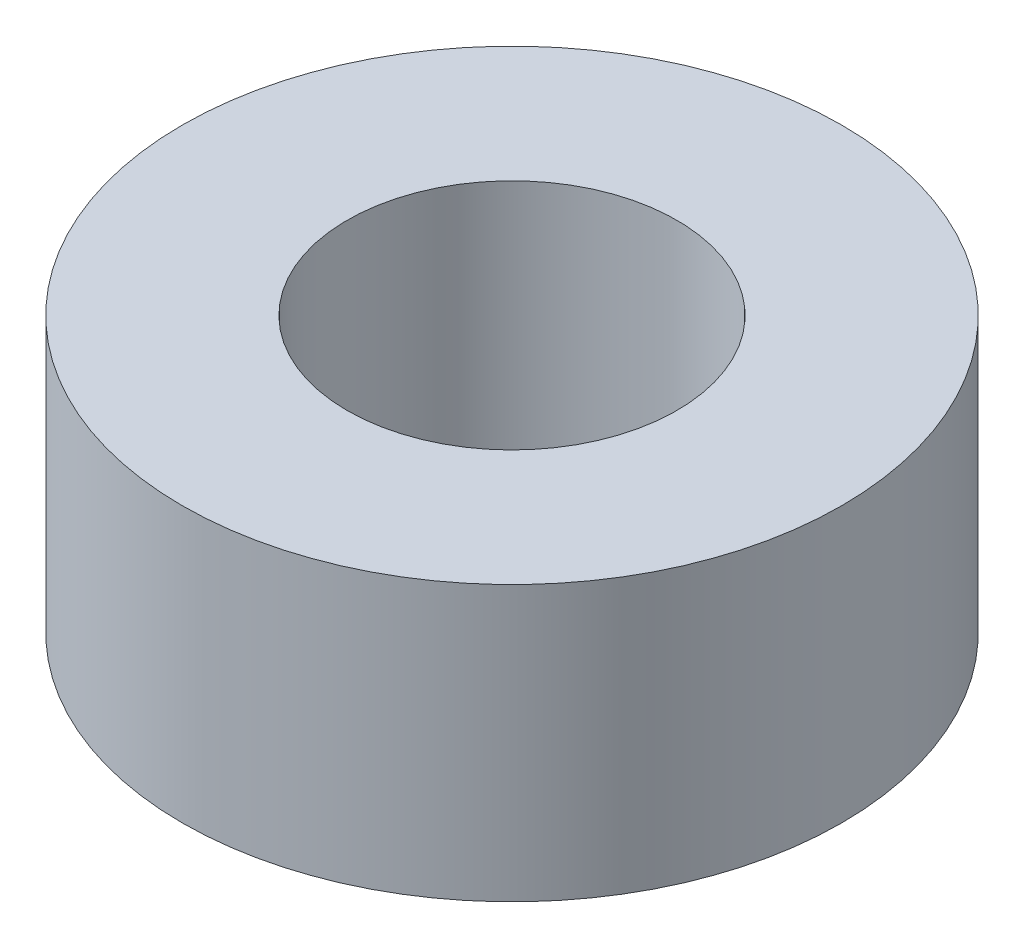
ISO-10303-21;
HEADER;
FILE_DESCRIPTION(('STEP AP214'),'2;1');
FILE_NAME('part.step','',(''),(''),'','','');
FILE_SCHEMA(('AUTOMOTIVE_DESIGN { 1 0 10303 214 1 1 1 1 }'));
ENDSEC;
DATA;
#1=APPLICATION_CONTEXT('core data for automotive mechanical design processes');
#2=APPLICATION_PROTOCOL_DEFINITION('international standard','automotive_design',2000,#1);
#3=PRODUCT_CONTEXT('',#1,'mechanical');
#4=PRODUCT('Part','Part','',(#3));
#5=PRODUCT_RELATED_PRODUCT_CATEGORY('part','',(#4));
#6=PRODUCT_DEFINITION_FORMATION('','',#4);
#7=PRODUCT_DEFINITION_CONTEXT('part definition',#1,'design');
#8=PRODUCT_DEFINITION('design','',#6,#7);
#9=PRODUCT_DEFINITION_SHAPE('','',#8);
#10=(LENGTH_UNIT() NAMED_UNIT(*) SI_UNIT(.MILLI.,.METRE.));
#11=(NAMED_UNIT(*) PLANE_ANGLE_UNIT() SI_UNIT($,.RADIAN.));
#12=(NAMED_UNIT(*) SI_UNIT($,.STERADIAN.) SOLID_ANGLE_UNIT());
#13=UNCERTAINTY_MEASURE_WITH_UNIT(LENGTH_MEASURE(1.E-05),#10,'distance_accuracy_value','');
#14=(GEOMETRIC_REPRESENTATION_CONTEXT(3) GLOBAL_UNCERTAINTY_ASSIGNED_CONTEXT((#13)) GLOBAL_UNIT_ASSIGNED_CONTEXT((#10,
#11,#12)) REPRESENTATION_CONTEXT('',''));
#15=CARTESIAN_POINT('',(0.,0.,0.));
#16=DIRECTION('',(0.,0.,1.));
#17=DIRECTION('',(1.,0.,0.));
#18=AXIS2_PLACEMENT_3D('',#15,#16,#17);
#19=CARTESIAN_POINT('',(0.,2.5,0.));
#20=DIRECTION('',(0.,1.,0.));
#21=DIRECTION('',(0.,0.,1.));
#22=AXIS2_PLACEMENT_3D('',#19,#20,#21);
#23=PLANE('',#22);
#24=CARTESIAN_POINT('',(0.,2.5,0.));
#25=DIRECTION('',(0.,1.,0.));
#26=DIRECTION('',(0.,0.,1.));
#27=AXIS2_PLACEMENT_3D('',#24,#25,#26);
#28=CIRCLE('',#27,3.);
#29=CARTESIAN_POINT('',(0.,2.5,3.));
#30=VERTEX_POINT('',#29);
#31=EDGE_CURVE('E10',#30,#30,#28,.T.);
#32=ORIENTED_EDGE('',*,*,#31,.T.);
#33=EDGE_LOOP('',(#32));
#34=FACE_BOUND('',#33,.T.);
#35=CARTESIAN_POINT('',(0.,2.5,0.));
#36=DIRECTION('',(0.,1.,0.));
#37=DIRECTION('',(0.,0.,1.));
#38=AXIS2_PLACEMENT_3D('',#35,#36,#37);
#39=CIRCLE('',#38,1.5);
#40=CARTESIAN_POINT('',(0.,2.5,1.5));
#41=VERTEX_POINT('',#40);
#42=EDGE_CURVE('E48',#41,#41,#39,.T.);
#43=ORIENTED_EDGE('',*,*,#42,.F.);
#44=EDGE_LOOP('',(#43));
#45=FACE_BOUND('',#44,.T.);
#46=ADVANCED_FACE('F40',(#34,#45),#23,.T.);
#47=CARTESIAN_POINT('',(0.,0.,0.));
#48=DIRECTION('',(0.,1.,0.));
#49=DIRECTION('',(0.,0.,1.));
#50=AXIS2_PLACEMENT_3D('',#47,#48,#49);
#51=PLANE('',#50);
#52=CARTESIAN_POINT('',(0.,0.,0.));
#53=DIRECTION('',(0.,1.,0.));
#54=DIRECTION('',(0.,0.,1.));
#55=AXIS2_PLACEMENT_3D('',#52,#53,#54);
#56=CIRCLE('',#55,3.);
#57=CARTESIAN_POINT('',(0.,0.,3.));
#58=VERTEX_POINT('',#57);
#59=EDGE_CURVE('E41',#58,#58,#56,.T.);
#60=ORIENTED_EDGE('',*,*,#59,.F.);
#61=EDGE_LOOP('',(#60));
#62=FACE_BOUND('',#61,.T.);
#63=CARTESIAN_POINT('',(0.,0.,0.));
#64=DIRECTION('',(0.,1.,0.));
#65=DIRECTION('',(0.,0.,1.));
#66=AXIS2_PLACEMENT_3D('',#63,#64,#65);
#67=CIRCLE('',#66,1.5);
#68=CARTESIAN_POINT('',(0.,0.,1.5));
#69=VERTEX_POINT('',#68);
#70=EDGE_CURVE('E49',#69,#69,#67,.T.);
#71=ORIENTED_EDGE('',*,*,#70,.T.);
#72=EDGE_LOOP('',(#71));
#73=FACE_BOUND('',#72,.T.);
#74=ADVANCED_FACE('F58',(#62,#73),#51,.F.);
#75=CARTESIAN_POINT('',(0.,2.5,0.));
#76=DIRECTION('',(0.,-1.,0.));
#77=DIRECTION('',(0.,0.,-1.));
#78=AXIS2_PLACEMENT_3D('',#75,#76,#77);
#79=CYLINDRICAL_SURFACE('',#78,3.);
#80=ORIENTED_EDGE('',*,*,#31,.F.);
#81=EDGE_LOOP('',(#80));
#82=FACE_BOUND('',#81,.T.);
#83=ORIENTED_EDGE('',*,*,#59,.T.);
#84=EDGE_LOOP('',(#83));
#85=FACE_BOUND('',#84,.T.);
#86=ADVANCED_FACE('F39',(#82,#85),#79,.T.);
#87=CARTESIAN_POINT('',(0.,2.5,0.));
#88=DIRECTION('',(0.,-1.,0.));
#89=DIRECTION('',(0.,0.,-1.));
#90=AXIS2_PLACEMENT_3D('',#87,#88,#89);
#91=CYLINDRICAL_SURFACE('',#90,1.5);
#92=ORIENTED_EDGE('',*,*,#42,.T.);
#93=EDGE_LOOP('',(#92));
#94=FACE_BOUND('',#93,.T.);
#95=ORIENTED_EDGE('',*,*,#70,.F.);
#96=EDGE_LOOP('',(#95));
#97=FACE_BOUND('',#96,.T.);
#98=ADVANCED_FACE('F57',(#94,#97),#91,.F.);
#99=CLOSED_SHELL('',(#46,#74,#86,#98));
#100=MANIFOLD_SOLID_BREP('B2',#99);
#101=ADVANCED_BREP_SHAPE_REPRESENTATION('',(#18,#100),#14);
#102=SHAPE_DEFINITION_REPRESENTATION(#9,#101);
ENDSEC;
END-ISO-10303-21;
